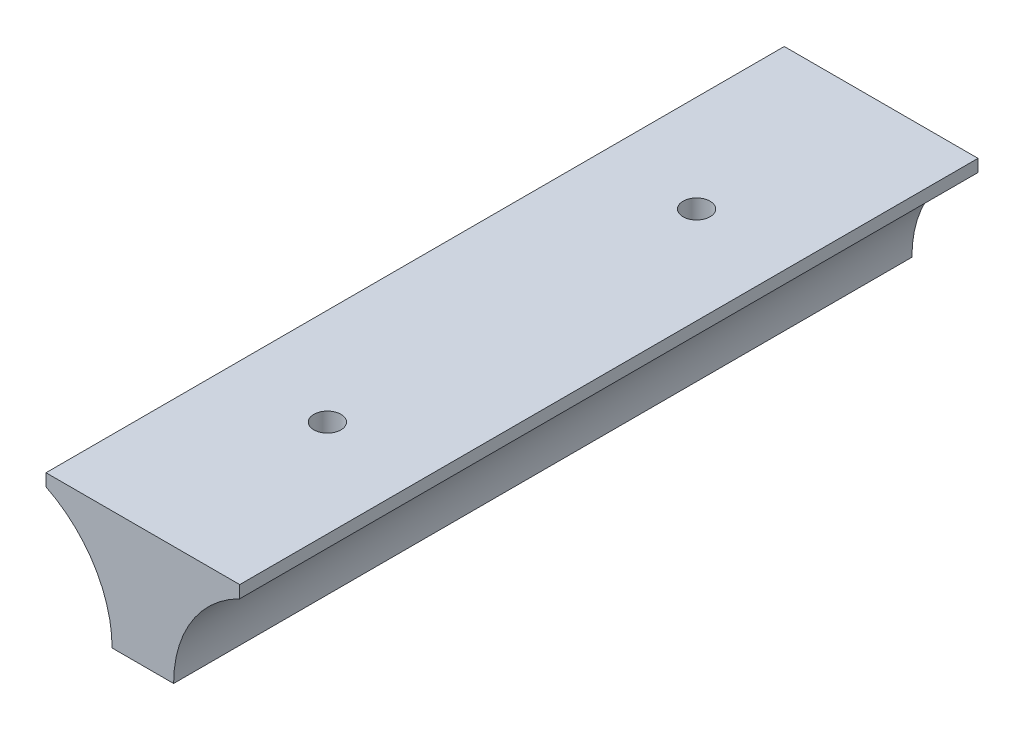
ISO-10303-21;
HEADER;
FILE_DESCRIPTION(('STEP AP214'),'2;1');
FILE_NAME('part.step','',(''),(''),'','','');
FILE_SCHEMA(('AUTOMOTIVE_DESIGN { 1 0 10303 214 1 1 1 1 }'));
ENDSEC;
DATA;
#1=APPLICATION_CONTEXT('core data for automotive mechanical design processes');
#2=APPLICATION_PROTOCOL_DEFINITION('international standard','automotive_design',2000,#1);
#3=PRODUCT_CONTEXT('',#1,'mechanical');
#4=PRODUCT('Part','Part','',(#3));
#5=PRODUCT_RELATED_PRODUCT_CATEGORY('part','',(#4));
#6=PRODUCT_DEFINITION_FORMATION('','',#4);
#7=PRODUCT_DEFINITION_CONTEXT('part definition',#1,'design');
#8=PRODUCT_DEFINITION('design','',#6,#7);
#9=PRODUCT_DEFINITION_SHAPE('','',#8);
#10=(LENGTH_UNIT() NAMED_UNIT(*) SI_UNIT(.MILLI.,.METRE.));
#11=(NAMED_UNIT(*) PLANE_ANGLE_UNIT() SI_UNIT($,.RADIAN.));
#12=(NAMED_UNIT(*) SI_UNIT($,.STERADIAN.) SOLID_ANGLE_UNIT());
#13=UNCERTAINTY_MEASURE_WITH_UNIT(LENGTH_MEASURE(1.E-05),#10,'distance_accuracy_value','');
#14=(GEOMETRIC_REPRESENTATION_CONTEXT(3) GLOBAL_UNCERTAINTY_ASSIGNED_CONTEXT((#13)) GLOBAL_UNIT_ASSIGNED_CONTEXT((#10,
#11,#12)) REPRESENTATION_CONTEXT('',''));
#15=CARTESIAN_POINT('',(0.,0.,0.));
#16=DIRECTION('',(0.,0.,1.));
#17=DIRECTION('',(1.,0.,0.));
#18=AXIS2_PLACEMENT_3D('',#15,#16,#17);
#19=CARTESIAN_POINT('',(7.87215007275851,9.65,60.));
#20=DIRECTION('',(0.,-1.,0.));
#21=DIRECTION('',(0.,0.,-1.));
#22=AXIS2_PLACEMENT_3D('',#19,#20,#21);
#23=PLANE('',#22);
#24=CARTESIAN_POINT('',(0.,9.65,45.));
#25=DIRECTION('',(0.,1.,0.));
#26=DIRECTION('',(0.,0.,1.));
#27=AXIS2_PLACEMENT_3D('',#24,#25,#26);
#28=CIRCLE('',#27,1.1);
#29=CARTESIAN_POINT('',(0.,9.65,46.1));
#30=VERTEX_POINT('',#29);
#31=EDGE_CURVE('E208',#30,#30,#28,.T.);
#32=ORIENTED_EDGE('',*,*,#31,.F.);
#33=EDGE_LOOP('',(#32));
#34=FACE_BOUND('',#33,.T.);
#35=DIRECTION('',(-1.,0.,0.));
#36=VECTOR('',#35,1.);
#37=CARTESIAN_POINT('',(7.87215007275851,9.65,0.));
#38=LINE('',#37,#36);
#39=CARTESIAN_POINT('',(7.87215007275851,9.65,0.));
#40=VERTEX_POINT('',#39);
#41=CARTESIAN_POINT('',(-7.87215007275851,9.65,0.));
#42=VERTEX_POINT('',#41);
#43=EDGE_CURVE('E80',#40,#42,#38,.T.);
#44=ORIENTED_EDGE('',*,*,#43,.T.);
#45=DIRECTION('',(0.,0.,-1.));
#46=VECTOR('',#45,1.);
#47=CARTESIAN_POINT('',(-7.87215007275851,9.65,60.));
#48=LINE('',#47,#46);
#49=CARTESIAN_POINT('',(-7.87215007275851,9.65,60.));
#50=VERTEX_POINT('',#49);
#51=EDGE_CURVE('E119',#50,#42,#48,.T.);
#52=ORIENTED_EDGE('',*,*,#51,.F.);
#53=DIRECTION('',(-1.,0.,0.));
#54=VECTOR('',#53,1.);
#55=CARTESIAN_POINT('',(7.87215007275851,9.65,60.));
#56=LINE('',#55,#54);
#57=CARTESIAN_POINT('',(7.87215007275851,9.65,60.));
#58=VERTEX_POINT('',#57);
#59=EDGE_CURVE('E105',#58,#50,#56,.T.);
#60=ORIENTED_EDGE('',*,*,#59,.F.);
#61=DIRECTION('',(0.,0.,-1.));
#62=VECTOR('',#61,1.);
#63=CARTESIAN_POINT('',(7.87215007275851,9.65,60.));
#64=LINE('',#63,#62);
#65=EDGE_CURVE('E113',#58,#40,#64,.T.);
#66=ORIENTED_EDGE('',*,*,#65,.T.);
#67=EDGE_LOOP('',(#44,#52,#60,#66));
#68=FACE_BOUND('',#67,.T.);
#69=CARTESIAN_POINT('',(0.,9.65,15.));
#70=DIRECTION('',(0.,1.,0.));
#71=DIRECTION('',(0.,0.,1.));
#72=AXIS2_PLACEMENT_3D('',#69,#70,#71);
#73=CIRCLE('',#72,1.1);
#74=CARTESIAN_POINT('',(0.,9.65,16.1));
#75=VERTEX_POINT('',#74);
#76=EDGE_CURVE('E195',#75,#75,#73,.T.);
#77=ORIENTED_EDGE('',*,*,#76,.F.);
#78=EDGE_LOOP('',(#77));
#79=FACE_BOUND('',#78,.T.);
#80=ADVANCED_FACE('F39',(#34,#68,#79),#23,.F.);
#81=CARTESIAN_POINT('',(-12.15,0.,60.));
#82=DIRECTION('',(0.,0.,-1.));
#83=DIRECTION('',(-1.,0.,0.));
#84=AXIS2_PLACEMENT_3D('',#81,#82,#83);
#85=CYLINDRICAL_SURFACE('',#84,9.65);
#86=CARTESIAN_POINT('',(-12.15,0.,0.));
#87=DIRECTION('',(0.,0.,-1.));
#88=DIRECTION('',(1.,0.,0.));
#89=AXIS2_PLACEMENT_3D('',#86,#87,#88);
#90=CIRCLE('',#89,9.65);
#91=CARTESIAN_POINT('',(-7.87215007275851,8.65,0.));
#92=VERTEX_POINT('',#91);
#93=CARTESIAN_POINT('',(-2.5,0.,0.));
#94=VERTEX_POINT('',#93);
#95=EDGE_CURVE('E129',#92,#94,#90,.T.);
#96=ORIENTED_EDGE('',*,*,#95,.T.);
#97=DIRECTION('',(0.,0.,-1.));
#98=VECTOR('',#97,1.);
#99=CARTESIAN_POINT('',(-2.5,0.,60.));
#100=LINE('',#99,#98);
#101=CARTESIAN_POINT('',(-2.5,0.,60.));
#102=VERTEX_POINT('',#101);
#103=EDGE_CURVE('E11',#102,#94,#100,.T.);
#104=ORIENTED_EDGE('',*,*,#103,.F.);
#105=CARTESIAN_POINT('',(-12.15,0.,60.));
#106=DIRECTION('',(0.,0.,-1.));
#107=DIRECTION('',(1.,0.,0.));
#108=AXIS2_PLACEMENT_3D('',#105,#106,#107);
#109=CIRCLE('',#108,9.65);
#110=CARTESIAN_POINT('',(-7.87215007275851,8.65,60.));
#111=VERTEX_POINT('',#110);
#112=EDGE_CURVE('E146',#111,#102,#109,.T.);
#113=ORIENTED_EDGE('',*,*,#112,.F.);
#114=DIRECTION('',(0.,0.,-1.));
#115=VECTOR('',#114,1.);
#116=CARTESIAN_POINT('',(-7.87215007275851,8.65,60.));
#117=LINE('',#116,#115);
#118=EDGE_CURVE('E125',#111,#92,#117,.T.);
#119=ORIENTED_EDGE('',*,*,#118,.T.);
#120=EDGE_LOOP('',(#96,#104,#113,#119));
#121=FACE_BOUND('',#120,.T.);
#122=ADVANCED_FACE('F41',(#121),#85,.F.);
#123=CARTESIAN_POINT('',(-2.5,0.,60.));
#124=DIRECTION('',(0.,1.,0.));
#125=DIRECTION('',(-1.,0.,0.));
#126=AXIS2_PLACEMENT_3D('',#123,#124,#125);
#127=PLANE('',#126);
#128=CARTESIAN_POINT('',(0.,0.,45.));
#129=DIRECTION('',(0.,1.,0.));
#130=DIRECTION('',(-1.,0.,0.));
#131=AXIS2_PLACEMENT_3D('',#128,#129,#130);
#132=CIRCLE('',#131,1.1);
#133=CARTESIAN_POINT('',(-1.1,0.,45.));
#134=VERTEX_POINT('',#133);
#135=EDGE_CURVE('E190',#134,#134,#132,.T.);
#136=ORIENTED_EDGE('',*,*,#135,.T.);
#137=EDGE_LOOP('',(#136));
#138=FACE_BOUND('',#137,.T.);
#139=CARTESIAN_POINT('',(0.,0.,15.));
#140=DIRECTION('',(0.,1.,0.));
#141=DIRECTION('',(-1.,0.,0.));
#142=AXIS2_PLACEMENT_3D('',#139,#140,#141);
#143=CIRCLE('',#142,1.1);
#144=CARTESIAN_POINT('',(-1.1,0.,15.));
#145=VERTEX_POINT('',#144);
#146=EDGE_CURVE('E134',#145,#145,#143,.T.);
#147=ORIENTED_EDGE('',*,*,#146,.T.);
#148=EDGE_LOOP('',(#147));
#149=FACE_BOUND('',#148,.T.);
#150=DIRECTION('',(1.,0.,0.));
#151=VECTOR('',#150,1.);
#152=CARTESIAN_POINT('',(-2.5,0.,0.));
#153=LINE('',#152,#151);
#154=CARTESIAN_POINT('',(2.5,0.,0.));
#155=VERTEX_POINT('',#154);
#156=EDGE_CURVE('E133',#94,#155,#153,.T.);
#157=ORIENTED_EDGE('',*,*,#156,.T.);
#158=DIRECTION('',(0.,0.,-1.));
#159=VECTOR('',#158,1.);
#160=CARTESIAN_POINT('',(2.5,0.,60.));
#161=LINE('',#160,#159);
#162=CARTESIAN_POINT('',(2.5,0.,60.));
#163=VERTEX_POINT('',#162);
#164=EDGE_CURVE('E49',#163,#155,#161,.T.);
#165=ORIENTED_EDGE('',*,*,#164,.F.);
#166=DIRECTION('',(1.,0.,0.));
#167=VECTOR('',#166,1.);
#168=CARTESIAN_POINT('',(-2.5,0.,60.));
#169=LINE('',#168,#167);
#170=EDGE_CURVE('E94',#102,#163,#169,.T.);
#171=ORIENTED_EDGE('',*,*,#170,.F.);
#172=ORIENTED_EDGE('',*,*,#103,.T.);
#173=EDGE_LOOP('',(#157,#165,#171,#172));
#174=FACE_BOUND('',#173,.T.);
#175=ADVANCED_FACE('F179',(#138,#149,#174),#127,.F.);
#176=CARTESIAN_POINT('',(12.15,0.,60.));
#177=DIRECTION('',(0.,0.,-1.));
#178=DIRECTION('',(-1.,0.,0.));
#179=AXIS2_PLACEMENT_3D('',#176,#177,#178);
#180=CYLINDRICAL_SURFACE('',#179,9.65);
#181=CARTESIAN_POINT('',(12.15,0.,0.));
#182=DIRECTION('',(0.,0.,-1.));
#183=DIRECTION('',(-1.,0.,0.));
#184=AXIS2_PLACEMENT_3D('',#181,#182,#183);
#185=CIRCLE('',#184,9.65);
#186=CARTESIAN_POINT('',(7.87215007275851,8.65,0.));
#187=VERTEX_POINT('',#186);
#188=EDGE_CURVE('E137',#155,#187,#185,.T.);
#189=ORIENTED_EDGE('',*,*,#188,.T.);
#190=DIRECTION('',(0.,0.,-1.));
#191=VECTOR('',#190,1.);
#192=CARTESIAN_POINT('',(7.87215007275851,8.65,60.));
#193=LINE('',#192,#191);
#194=CARTESIAN_POINT('',(7.87215007275851,8.65,60.));
#195=VERTEX_POINT('',#194);
#196=EDGE_CURVE('E118',#195,#187,#193,.T.);
#197=ORIENTED_EDGE('',*,*,#196,.F.);
#198=CARTESIAN_POINT('',(12.15,0.,60.));
#199=DIRECTION('',(0.,0.,-1.));
#200=DIRECTION('',(-1.,0.,0.));
#201=AXIS2_PLACEMENT_3D('',#198,#199,#200);
#202=CIRCLE('',#201,9.65);
#203=EDGE_CURVE('E107',#163,#195,#202,.T.);
#204=ORIENTED_EDGE('',*,*,#203,.F.);
#205=ORIENTED_EDGE('',*,*,#164,.T.);
#206=EDGE_LOOP('',(#189,#197,#204,#205));
#207=FACE_BOUND('',#206,.T.);
#208=ADVANCED_FACE('F156',(#207),#180,.F.);
#209=CARTESIAN_POINT('',(7.87215007275851,8.65,60.));
#210=DIRECTION('',(-1.,0.,0.));
#211=DIRECTION('',(0.,0.,1.));
#212=AXIS2_PLACEMENT_3D('',#209,#210,#211);
#213=PLANE('',#212);
#214=DIRECTION('',(0.,1.,0.));
#215=VECTOR('',#214,1.);
#216=CARTESIAN_POINT('',(7.87215007275851,8.65,0.));
#217=LINE('',#216,#215);
#218=EDGE_CURVE('E116',#187,#40,#217,.T.);
#219=ORIENTED_EDGE('',*,*,#218,.T.);
#220=ORIENTED_EDGE('',*,*,#65,.F.);
#221=DIRECTION('',(0.,1.,0.));
#222=VECTOR('',#221,1.);
#223=CARTESIAN_POINT('',(7.87215007275851,8.65,60.));
#224=LINE('',#223,#222);
#225=EDGE_CURVE('E101',#195,#58,#224,.T.);
#226=ORIENTED_EDGE('',*,*,#225,.F.);
#227=ORIENTED_EDGE('',*,*,#196,.T.);
#228=EDGE_LOOP('',(#219,#220,#226,#227));
#229=FACE_BOUND('',#228,.T.);
#230=ADVANCED_FACE('F114',(#229),#213,.F.);
#231=CARTESIAN_POINT('',(-7.87215007275851,9.65,60.));
#232=DIRECTION('',(1.,0.,0.));
#233=DIRECTION('',(0.,0.,-1.));
#234=AXIS2_PLACEMENT_3D('',#231,#232,#233);
#235=PLANE('',#234);
#236=DIRECTION('',(0.,-1.,0.));
#237=VECTOR('',#236,1.);
#238=CARTESIAN_POINT('',(-7.87215007275851,9.65,0.));
#239=LINE('',#238,#237);
#240=EDGE_CURVE('E86',#42,#92,#239,.T.);
#241=ORIENTED_EDGE('',*,*,#240,.T.);
#242=ORIENTED_EDGE('',*,*,#118,.F.);
#243=DIRECTION('',(0.,-1.,0.));
#244=VECTOR('',#243,1.);
#245=CARTESIAN_POINT('',(-7.87215007275851,9.65,60.));
#246=LINE('',#245,#244);
#247=EDGE_CURVE('E57',#50,#111,#246,.T.);
#248=ORIENTED_EDGE('',*,*,#247,.F.);
#249=ORIENTED_EDGE('',*,*,#51,.T.);
#250=EDGE_LOOP('',(#241,#242,#248,#249));
#251=FACE_BOUND('',#250,.T.);
#252=ADVANCED_FACE('F163',(#251),#235,.F.);
#253=CARTESIAN_POINT('',(-12.15,0.,60.));
#254=DIRECTION('',(0.,0.,1.));
#255=DIRECTION('',(1.,0.,0.));
#256=AXIS2_PLACEMENT_3D('',#253,#254,#255);
#257=PLANE('',#256);
#258=ORIENTED_EDGE('',*,*,#112,.T.);
#259=ORIENTED_EDGE('',*,*,#170,.T.);
#260=ORIENTED_EDGE('',*,*,#203,.T.);
#261=ORIENTED_EDGE('',*,*,#225,.T.);
#262=ORIENTED_EDGE('',*,*,#59,.T.);
#263=ORIENTED_EDGE('',*,*,#247,.T.);
#264=EDGE_LOOP('',(#258,#259,#260,#261,#262,#263));
#265=FACE_BOUND('',#264,.T.);
#266=ADVANCED_FACE('F103',(#265),#257,.T.);
#267=CARTESIAN_POINT('',(-12.15,0.,0.));
#268=DIRECTION('',(0.,0.,1.));
#269=DIRECTION('',(1.,0.,0.));
#270=AXIS2_PLACEMENT_3D('',#267,#268,#269);
#271=PLANE('',#270);
#272=ORIENTED_EDGE('',*,*,#95,.F.);
#273=ORIENTED_EDGE('',*,*,#240,.F.);
#274=ORIENTED_EDGE('',*,*,#43,.F.);
#275=ORIENTED_EDGE('',*,*,#218,.F.);
#276=ORIENTED_EDGE('',*,*,#188,.F.);
#277=ORIENTED_EDGE('',*,*,#156,.F.);
#278=EDGE_LOOP('',(#272,#273,#274,#275,#276,#277));
#279=FACE_BOUND('',#278,.T.);
#280=ADVANCED_FACE('F159',(#279),#271,.F.);
#281=CARTESIAN_POINT('',(0.,9.65,15.));
#282=DIRECTION('',(0.,1.,0.));
#283=DIRECTION('',(0.,0.,1.));
#284=AXIS2_PLACEMENT_3D('',#281,#282,#283);
#285=CYLINDRICAL_SURFACE('',#284,1.1);
#286=ORIENTED_EDGE('',*,*,#146,.F.);
#287=EDGE_LOOP('',(#286));
#288=FACE_BOUND('',#287,.T.);
#289=ORIENTED_EDGE('',*,*,#76,.T.);
#290=EDGE_LOOP('',(#289));
#291=FACE_BOUND('',#290,.T.);
#292=ADVANCED_FACE('F214',(#288,#291),#285,.F.);
#293=CARTESIAN_POINT('',(0.,9.65,45.));
#294=DIRECTION('',(0.,1.,0.));
#295=DIRECTION('',(0.,0.,1.));
#296=AXIS2_PLACEMENT_3D('',#293,#294,#295);
#297=CYLINDRICAL_SURFACE('',#296,1.1);
#298=ORIENTED_EDGE('',*,*,#135,.F.);
#299=EDGE_LOOP('',(#298));
#300=FACE_BOUND('',#299,.T.);
#301=ORIENTED_EDGE('',*,*,#31,.T.);
#302=EDGE_LOOP('',(#301));
#303=FACE_BOUND('',#302,.T.);
#304=ADVANCED_FACE('F212',(#300,#303),#297,.F.);
#305=CLOSED_SHELL('',(#80,#122,#175,#208,#230,#252,#266,#280,#292,#304));
#306=MANIFOLD_SOLID_BREP('B2',#305);
#307=ADVANCED_BREP_SHAPE_REPRESENTATION('',(#18,#306),#14);
#308=SHAPE_DEFINITION_REPRESENTATION(#9,#307);
ENDSEC;
END-ISO-10303-21;
